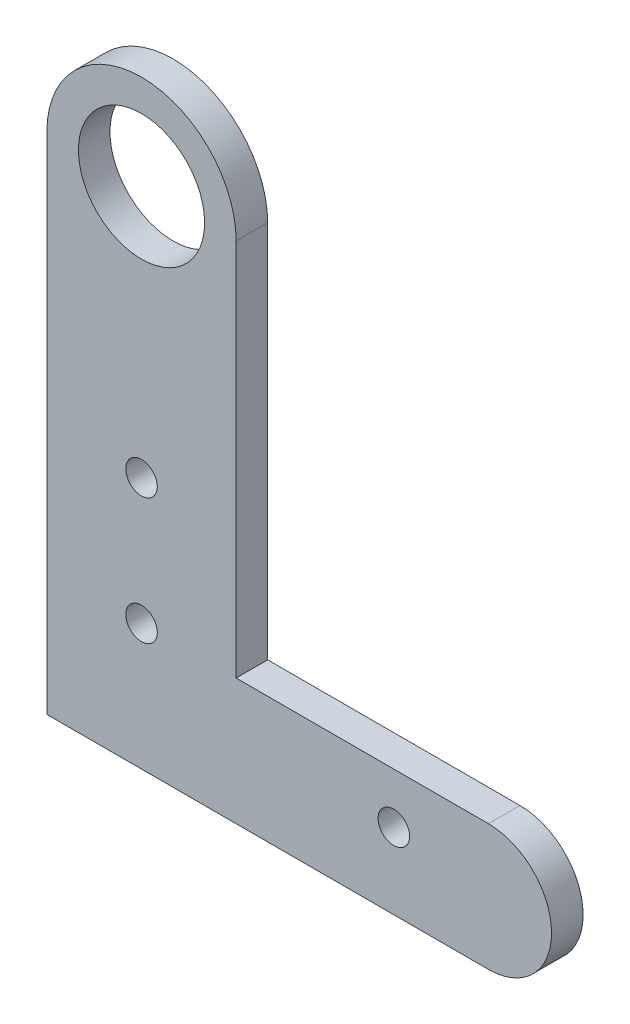
ISO-10303-21;
HEADER;
FILE_DESCRIPTION(('STEP AP214'),'2;1');
FILE_NAME('part.step','',(''),(''),'','','');
FILE_SCHEMA(('AUTOMOTIVE_DESIGN { 1 0 10303 214 1 1 1 1 }'));
ENDSEC;
DATA;
#1=APPLICATION_CONTEXT('core data for automotive mechanical design processes');
#2=APPLICATION_PROTOCOL_DEFINITION('international standard','automotive_design',2000,#1);
#3=PRODUCT_CONTEXT('',#1,'mechanical');
#4=PRODUCT('Part','Part','',(#3));
#5=PRODUCT_RELATED_PRODUCT_CATEGORY('part','',(#4));
#6=PRODUCT_DEFINITION_FORMATION('','',#4);
#7=PRODUCT_DEFINITION_CONTEXT('part definition',#1,'design');
#8=PRODUCT_DEFINITION('design','',#6,#7);
#9=PRODUCT_DEFINITION_SHAPE('','',#8);
#10=(LENGTH_UNIT() NAMED_UNIT(*) SI_UNIT(.MILLI.,.METRE.));
#11=(NAMED_UNIT(*) PLANE_ANGLE_UNIT() SI_UNIT($,.RADIAN.));
#12=(NAMED_UNIT(*) SI_UNIT($,.STERADIAN.) SOLID_ANGLE_UNIT());
#13=UNCERTAINTY_MEASURE_WITH_UNIT(LENGTH_MEASURE(1.E-05),#10,'distance_accuracy_value','');
#14=(GEOMETRIC_REPRESENTATION_CONTEXT(3) GLOBAL_UNCERTAINTY_ASSIGNED_CONTEXT((#13)) GLOBAL_UNIT_ASSIGNED_CONTEXT((#10,
#11,#12)) REPRESENTATION_CONTEXT('',''));
#15=CARTESIAN_POINT('',(0.,0.,0.));
#16=DIRECTION('',(0.,0.,1.));
#17=DIRECTION('',(1.,0.,0.));
#18=AXIS2_PLACEMENT_3D('',#15,#16,#17);
#19=CARTESIAN_POINT('',(70.,10.,5.));
#20=DIRECTION('',(0.,0.,1.));
#21=DIRECTION('',(1.,0.,0.));
#22=AXIS2_PLACEMENT_3D('',#19,#20,#21);
#23=PLANE('',#22);
#24=CARTESIAN_POINT('',(15.0000000000003,20.,5.));
#25=DIRECTION('',(0.,0.,1.));
#26=DIRECTION('',(1.,0.,0.));
#27=AXIS2_PLACEMENT_3D('',#24,#25,#26);
#28=CIRCLE('',#27,2.5);
#29=CARTESIAN_POINT('',(17.5000000000003,20.,5.));
#30=VERTEX_POINT('',#29);
#31=EDGE_CURVE('E191',#30,#30,#28,.T.);
#32=ORIENTED_EDGE('',*,*,#31,.F.);
#33=EDGE_LOOP('',(#32));
#34=FACE_BOUND('',#33,.T.);
#35=CARTESIAN_POINT('',(55.,12.,5.));
#36=DIRECTION('',(0.,0.,1.));
#37=DIRECTION('',(1.,0.,0.));
#38=AXIS2_PLACEMENT_3D('',#35,#36,#37);
#39=CIRCLE('',#38,2.49999999999999);
#40=CARTESIAN_POINT('',(57.5,12.,5.));
#41=VERTEX_POINT('',#40);
#42=EDGE_CURVE('E124',#41,#41,#39,.T.);
#43=ORIENTED_EDGE('',*,*,#42,.F.);
#44=EDGE_LOOP('',(#43));
#45=FACE_BOUND('',#44,.T.);
#46=DIRECTION('',(0.,-1.,0.));
#47=VECTOR('',#46,1.);
#48=CARTESIAN_POINT('',(0.,80.,5.));
#49=LINE('',#48,#47);
#50=CARTESIAN_POINT('',(0.,80.,5.));
#51=VERTEX_POINT('',#50);
#52=CARTESIAN_POINT('',(0.,0.,5.));
#53=VERTEX_POINT('',#52);
#54=EDGE_CURVE('E131',#51,#53,#49,.T.);
#55=ORIENTED_EDGE('',*,*,#54,.T.);
#56=DIRECTION('',(1.,0.,0.));
#57=VECTOR('',#56,1.);
#58=CARTESIAN_POINT('',(0.,0.,5.));
#59=LINE('',#58,#57);
#60=CARTESIAN_POINT('',(70.,0.,5.));
#61=VERTEX_POINT('',#60);
#62=EDGE_CURVE('E89',#53,#61,#59,.T.);
#63=ORIENTED_EDGE('',*,*,#62,.T.);
#64=CARTESIAN_POINT('',(70.,10.,5.));
#65=DIRECTION('',(0.,0.,1.));
#66=DIRECTION('',(1.,0.,0.));
#67=AXIS2_PLACEMENT_3D('',#64,#65,#66);
#68=CIRCLE('',#67,10.);
#69=CARTESIAN_POINT('',(70.,20.,5.));
#70=VERTEX_POINT('',#69);
#71=EDGE_CURVE('E102',#61,#70,#68,.T.);
#72=ORIENTED_EDGE('',*,*,#71,.T.);
#73=DIRECTION('',(-1.,0.,0.));
#74=VECTOR('',#73,1.);
#75=CARTESIAN_POINT('',(70.,20.,5.));
#76=LINE('',#75,#74);
#77=CARTESIAN_POINT('',(30.,20.,5.));
#78=VERTEX_POINT('',#77);
#79=EDGE_CURVE('E96',#70,#78,#76,.T.);
#80=ORIENTED_EDGE('',*,*,#79,.T.);
#81=DIRECTION('',(0.,1.,0.));
#82=VECTOR('',#81,1.);
#83=CARTESIAN_POINT('',(30.,20.,5.));
#84=LINE('',#83,#82);
#85=CARTESIAN_POINT('',(30.,80.,5.));
#86=VERTEX_POINT('',#85);
#87=EDGE_CURVE('E100',#78,#86,#84,.T.);
#88=ORIENTED_EDGE('',*,*,#87,.T.);
#89=CARTESIAN_POINT('',(15.,80.,5.));
#90=DIRECTION('',(0.,0.,1.));
#91=DIRECTION('',(1.,0.,0.));
#92=AXIS2_PLACEMENT_3D('',#89,#90,#91);
#93=CIRCLE('',#92,15.);
#94=EDGE_CURVE('E52',#86,#51,#93,.T.);
#95=ORIENTED_EDGE('',*,*,#94,.T.);
#96=EDGE_LOOP('',(#55,#63,#72,#80,#88,#95));
#97=FACE_BOUND('',#96,.T.);
#98=CARTESIAN_POINT('',(15.,80.,5.));
#99=DIRECTION('',(0.,0.,1.));
#100=DIRECTION('',(1.,0.,0.));
#101=AXIS2_PLACEMENT_3D('',#98,#99,#100);
#102=CIRCLE('',#101,10.);
#103=CARTESIAN_POINT('',(25.,80.,5.));
#104=VERTEX_POINT('',#103);
#105=EDGE_CURVE('E197',#104,#104,#102,.T.);
#106=ORIENTED_EDGE('',*,*,#105,.F.);
#107=EDGE_LOOP('',(#106));
#108=FACE_BOUND('',#107,.T.);
#109=CARTESIAN_POINT('',(15.0000000000002,40.,5.));
#110=DIRECTION('',(0.,0.,1.));
#111=DIRECTION('',(1.,0.,0.));
#112=AXIS2_PLACEMENT_3D('',#109,#110,#111);
#113=CIRCLE('',#112,2.5);
#114=CARTESIAN_POINT('',(17.5000000000002,40.,5.));
#115=VERTEX_POINT('',#114);
#116=EDGE_CURVE('E182',#115,#115,#113,.T.);
#117=ORIENTED_EDGE('',*,*,#116,.F.);
#118=EDGE_LOOP('',(#117));
#119=FACE_BOUND('',#118,.T.);
#120=ADVANCED_FACE('F35',(#34,#45,#97,#108,#119),#23,.T.);
#121=CARTESIAN_POINT('',(70.,10.,0.));
#122=DIRECTION('',(0.,0.,1.));
#123=DIRECTION('',(1.,0.,0.));
#124=AXIS2_PLACEMENT_3D('',#121,#122,#123);
#125=PLANE('',#124);
#126=DIRECTION('',(0.,-1.,0.));
#127=VECTOR('',#126,1.);
#128=CARTESIAN_POINT('',(0.,80.,0.));
#129=LINE('',#128,#127);
#130=CARTESIAN_POINT('',(0.,80.,0.));
#131=VERTEX_POINT('',#130);
#132=CARTESIAN_POINT('',(0.,0.,0.));
#133=VERTEX_POINT('',#132);
#134=EDGE_CURVE('E120',#131,#133,#129,.T.);
#135=ORIENTED_EDGE('',*,*,#134,.F.);
#136=CARTESIAN_POINT('',(15.,80.,0.));
#137=DIRECTION('',(0.,0.,1.));
#138=DIRECTION('',(1.,0.,0.));
#139=AXIS2_PLACEMENT_3D('',#136,#137,#138);
#140=CIRCLE('',#139,15.);
#141=CARTESIAN_POINT('',(30.,80.,0.));
#142=VERTEX_POINT('',#141);
#143=EDGE_CURVE('E81',#142,#131,#140,.T.);
#144=ORIENTED_EDGE('',*,*,#143,.F.);
#145=DIRECTION('',(0.,1.,0.));
#146=VECTOR('',#145,1.);
#147=CARTESIAN_POINT('',(30.,20.,0.));
#148=LINE('',#147,#146);
#149=CARTESIAN_POINT('',(30.,20.,0.));
#150=VERTEX_POINT('',#149);
#151=EDGE_CURVE('E75',#150,#142,#148,.T.);
#152=ORIENTED_EDGE('',*,*,#151,.F.);
#153=DIRECTION('',(-1.,0.,0.));
#154=VECTOR('',#153,1.);
#155=CARTESIAN_POINT('',(70.,20.,0.));
#156=LINE('',#155,#154);
#157=CARTESIAN_POINT('',(70.,20.,0.));
#158=VERTEX_POINT('',#157);
#159=EDGE_CURVE('E110',#158,#150,#156,.T.);
#160=ORIENTED_EDGE('',*,*,#159,.F.);
#161=CARTESIAN_POINT('',(70.,10.,0.));
#162=DIRECTION('',(0.,0.,1.));
#163=DIRECTION('',(1.,0.,0.));
#164=AXIS2_PLACEMENT_3D('',#161,#162,#163);
#165=CIRCLE('',#164,10.);
#166=CARTESIAN_POINT('',(70.,0.,0.));
#167=VERTEX_POINT('',#166);
#168=EDGE_CURVE('E126',#167,#158,#165,.T.);
#169=ORIENTED_EDGE('',*,*,#168,.F.);
#170=DIRECTION('',(1.,0.,0.));
#171=VECTOR('',#170,1.);
#172=CARTESIAN_POINT('',(0.,0.,0.));
#173=LINE('',#172,#171);
#174=EDGE_CURVE('E123',#133,#167,#173,.T.);
#175=ORIENTED_EDGE('',*,*,#174,.F.);
#176=EDGE_LOOP('',(#135,#144,#152,#160,#169,#175));
#177=FACE_BOUND('',#176,.T.);
#178=CARTESIAN_POINT('',(55.,12.,0.));
#179=DIRECTION('',(0.,0.,1.));
#180=DIRECTION('',(1.,0.,0.));
#181=AXIS2_PLACEMENT_3D('',#178,#179,#180);
#182=CIRCLE('',#181,2.49999999999999);
#183=CARTESIAN_POINT('',(57.5,12.,0.));
#184=VERTEX_POINT('',#183);
#185=EDGE_CURVE('E200',#184,#184,#182,.T.);
#186=ORIENTED_EDGE('',*,*,#185,.T.);
#187=EDGE_LOOP('',(#186));
#188=FACE_BOUND('',#187,.T.);
#189=CARTESIAN_POINT('',(15.,80.,0.));
#190=DIRECTION('',(0.,0.,1.));
#191=DIRECTION('',(1.,0.,0.));
#192=AXIS2_PLACEMENT_3D('',#189,#190,#191);
#193=CIRCLE('',#192,10.);
#194=CARTESIAN_POINT('',(25.,80.,0.));
#195=VERTEX_POINT('',#194);
#196=EDGE_CURVE('E194',#195,#195,#193,.T.);
#197=ORIENTED_EDGE('',*,*,#196,.T.);
#198=EDGE_LOOP('',(#197));
#199=FACE_BOUND('',#198,.T.);
#200=CARTESIAN_POINT('',(15.0000000000003,20.,0.));
#201=DIRECTION('',(0.,0.,1.));
#202=DIRECTION('',(1.,0.,0.));
#203=AXIS2_PLACEMENT_3D('',#200,#201,#202);
#204=CIRCLE('',#203,2.5);
#205=CARTESIAN_POINT('',(17.5000000000003,20.,0.));
#206=VERTEX_POINT('',#205);
#207=EDGE_CURVE('E188',#206,#206,#204,.T.);
#208=ORIENTED_EDGE('',*,*,#207,.T.);
#209=EDGE_LOOP('',(#208));
#210=FACE_BOUND('',#209,.T.);
#211=CARTESIAN_POINT('',(15.0000000000002,40.,0.));
#212=DIRECTION('',(0.,0.,1.));
#213=DIRECTION('',(1.,0.,0.));
#214=AXIS2_PLACEMENT_3D('',#211,#212,#213);
#215=CIRCLE('',#214,2.5);
#216=CARTESIAN_POINT('',(17.5000000000002,40.,0.));
#217=VERTEX_POINT('',#216);
#218=EDGE_CURVE('E185',#217,#217,#215,.T.);
#219=ORIENTED_EDGE('',*,*,#218,.T.);
#220=EDGE_LOOP('',(#219));
#221=FACE_BOUND('',#220,.T.);
#222=ADVANCED_FACE('F140',(#177,#188,#199,#210,#221),#125,.F.);
#223=CARTESIAN_POINT('',(0.,80.,5.));
#224=DIRECTION('',(1.,0.,0.));
#225=DIRECTION('',(0.,1.,0.));
#226=AXIS2_PLACEMENT_3D('',#223,#224,#225);
#227=PLANE('',#226);
#228=ORIENTED_EDGE('',*,*,#134,.T.);
#229=DIRECTION('',(0.,0.,-1.));
#230=VECTOR('',#229,1.);
#231=CARTESIAN_POINT('',(0.,0.,5.));
#232=LINE('',#231,#230);
#233=EDGE_CURVE('E11',#53,#133,#232,.T.);
#234=ORIENTED_EDGE('',*,*,#233,.F.);
#235=ORIENTED_EDGE('',*,*,#54,.F.);
#236=DIRECTION('',(0.,0.,-1.));
#237=VECTOR('',#236,1.);
#238=CARTESIAN_POINT('',(0.,80.,5.));
#239=LINE('',#238,#237);
#240=EDGE_CURVE('E116',#51,#131,#239,.T.);
#241=ORIENTED_EDGE('',*,*,#240,.T.);
#242=EDGE_LOOP('',(#228,#234,#235,#241));
#243=FACE_BOUND('',#242,.T.);
#244=ADVANCED_FACE('F37',(#243),#227,.F.);
#245=CARTESIAN_POINT('',(0.,0.,5.));
#246=DIRECTION('',(0.,1.,0.));
#247=DIRECTION('',(0.,0.,1.));
#248=AXIS2_PLACEMENT_3D('',#245,#246,#247);
#249=PLANE('',#248);
#250=ORIENTED_EDGE('',*,*,#174,.T.);
#251=DIRECTION('',(0.,0.,-1.));
#252=VECTOR('',#251,1.);
#253=CARTESIAN_POINT('',(70.,0.,5.));
#254=LINE('',#253,#252);
#255=EDGE_CURVE('E44',#61,#167,#254,.T.);
#256=ORIENTED_EDGE('',*,*,#255,.F.);
#257=ORIENTED_EDGE('',*,*,#62,.F.);
#258=ORIENTED_EDGE('',*,*,#233,.T.);
#259=EDGE_LOOP('',(#250,#256,#257,#258));
#260=FACE_BOUND('',#259,.T.);
#261=ADVANCED_FACE('F258',(#260),#249,.F.);
#262=CARTESIAN_POINT('',(70.,10.,5.));
#263=DIRECTION('',(0.,0.,-1.));
#264=DIRECTION('',(-1.,0.,0.));
#265=AXIS2_PLACEMENT_3D('',#262,#263,#264);
#266=CYLINDRICAL_SURFACE('',#265,10.);
#267=ORIENTED_EDGE('',*,*,#168,.T.);
#268=DIRECTION('',(0.,0.,-1.));
#269=VECTOR('',#268,1.);
#270=CARTESIAN_POINT('',(70.,20.,5.));
#271=LINE('',#270,#269);
#272=EDGE_CURVE('E111',#70,#158,#271,.T.);
#273=ORIENTED_EDGE('',*,*,#272,.F.);
#274=ORIENTED_EDGE('',*,*,#71,.F.);
#275=ORIENTED_EDGE('',*,*,#255,.T.);
#276=EDGE_LOOP('',(#267,#273,#274,#275));
#277=FACE_BOUND('',#276,.T.);
#278=ADVANCED_FACE('F137',(#277),#266,.T.);
#279=CARTESIAN_POINT('',(70.,20.,5.));
#280=DIRECTION('',(0.,-1.,0.));
#281=DIRECTION('',(1.,0.,0.));
#282=AXIS2_PLACEMENT_3D('',#279,#280,#281);
#283=PLANE('',#282);
#284=ORIENTED_EDGE('',*,*,#159,.T.);
#285=DIRECTION('',(0.,0.,-1.));
#286=VECTOR('',#285,1.);
#287=CARTESIAN_POINT('',(30.,20.,5.));
#288=LINE('',#287,#286);
#289=EDGE_CURVE('E107',#78,#150,#288,.T.);
#290=ORIENTED_EDGE('',*,*,#289,.F.);
#291=ORIENTED_EDGE('',*,*,#79,.F.);
#292=ORIENTED_EDGE('',*,*,#272,.T.);
#293=EDGE_LOOP('',(#284,#290,#291,#292));
#294=FACE_BOUND('',#293,.T.);
#295=ADVANCED_FACE('F108',(#294),#283,.F.);
#296=CARTESIAN_POINT('',(30.,20.,5.));
#297=DIRECTION('',(-1.,0.,0.));
#298=DIRECTION('',(0.,-1.,0.));
#299=AXIS2_PLACEMENT_3D('',#296,#297,#298);
#300=PLANE('',#299);
#301=ORIENTED_EDGE('',*,*,#151,.T.);
#302=DIRECTION('',(0.,0.,-1.));
#303=VECTOR('',#302,1.);
#304=CARTESIAN_POINT('',(30.,80.,5.));
#305=LINE('',#304,#303);
#306=EDGE_CURVE('E112',#86,#142,#305,.T.);
#307=ORIENTED_EDGE('',*,*,#306,.F.);
#308=ORIENTED_EDGE('',*,*,#87,.F.);
#309=ORIENTED_EDGE('',*,*,#289,.T.);
#310=EDGE_LOOP('',(#301,#307,#308,#309));
#311=FACE_BOUND('',#310,.T.);
#312=ADVANCED_FACE('F114',(#311),#300,.F.);
#313=CARTESIAN_POINT('',(15.,80.,5.));
#314=DIRECTION('',(0.,0.,-1.));
#315=DIRECTION('',(-1.,0.,0.));
#316=AXIS2_PLACEMENT_3D('',#313,#314,#315);
#317=CYLINDRICAL_SURFACE('',#316,15.);
#318=ORIENTED_EDGE('',*,*,#143,.T.);
#319=ORIENTED_EDGE('',*,*,#240,.F.);
#320=ORIENTED_EDGE('',*,*,#94,.F.);
#321=ORIENTED_EDGE('',*,*,#306,.T.);
#322=EDGE_LOOP('',(#318,#319,#320,#321));
#323=FACE_BOUND('',#322,.T.);
#324=ADVANCED_FACE('F145',(#323),#317,.T.);
#325=CARTESIAN_POINT('',(55.,12.,5.));
#326=DIRECTION('',(0.,0.,-1.));
#327=DIRECTION('',(-1.,0.,0.));
#328=AXIS2_PLACEMENT_3D('',#325,#326,#327);
#329=CYLINDRICAL_SURFACE('',#328,2.49999999999999);
#330=ORIENTED_EDGE('',*,*,#42,.T.);
#331=EDGE_LOOP('',(#330));
#332=FACE_BOUND('',#331,.T.);
#333=ORIENTED_EDGE('',*,*,#185,.F.);
#334=EDGE_LOOP('',(#333));
#335=FACE_BOUND('',#334,.T.);
#336=ADVANCED_FACE('F147',(#332,#335),#329,.F.);
#337=CARTESIAN_POINT('',(15.,80.,5.));
#338=DIRECTION('',(0.,0.,-1.));
#339=DIRECTION('',(-1.,0.,0.));
#340=AXIS2_PLACEMENT_3D('',#337,#338,#339);
#341=CYLINDRICAL_SURFACE('',#340,10.);
#342=ORIENTED_EDGE('',*,*,#105,.T.);
#343=EDGE_LOOP('',(#342));
#344=FACE_BOUND('',#343,.T.);
#345=ORIENTED_EDGE('',*,*,#196,.F.);
#346=EDGE_LOOP('',(#345));
#347=FACE_BOUND('',#346,.T.);
#348=ADVANCED_FACE('F153',(#344,#347),#341,.F.);
#349=CARTESIAN_POINT('',(15.0000000000003,20.,5.));
#350=DIRECTION('',(0.,0.,-1.));
#351=DIRECTION('',(-1.,0.,0.));
#352=AXIS2_PLACEMENT_3D('',#349,#350,#351);
#353=CYLINDRICAL_SURFACE('',#352,2.5);
#354=ORIENTED_EDGE('',*,*,#31,.T.);
#355=EDGE_LOOP('',(#354));
#356=FACE_BOUND('',#355,.T.);
#357=ORIENTED_EDGE('',*,*,#207,.F.);
#358=EDGE_LOOP('',(#357));
#359=FACE_BOUND('',#358,.T.);
#360=ADVANCED_FACE('F169',(#356,#359),#353,.F.);
#361=CARTESIAN_POINT('',(15.0000000000002,40.,5.));
#362=DIRECTION('',(0.,0.,-1.));
#363=DIRECTION('',(-1.,0.,0.));
#364=AXIS2_PLACEMENT_3D('',#361,#362,#363);
#365=CYLINDRICAL_SURFACE('',#364,2.5);
#366=ORIENTED_EDGE('',*,*,#116,.T.);
#367=EDGE_LOOP('',(#366));
#368=FACE_BOUND('',#367,.T.);
#369=ORIENTED_EDGE('',*,*,#218,.F.);
#370=EDGE_LOOP('',(#369));
#371=FACE_BOUND('',#370,.T.);
#372=ADVANCED_FACE('F173',(#368,#371),#365,.F.);
#373=CLOSED_SHELL('',(#120,#222,#244,#261,#278,#295,#312,#324,#336,#348,#360,#372));
#374=MANIFOLD_SOLID_BREP('B2',#373);
#375=ADVANCED_BREP_SHAPE_REPRESENTATION('',(#18,#374),#14);
#376=SHAPE_DEFINITION_REPRESENTATION(#9,#375);
ENDSEC;
END-ISO-10303-21;
